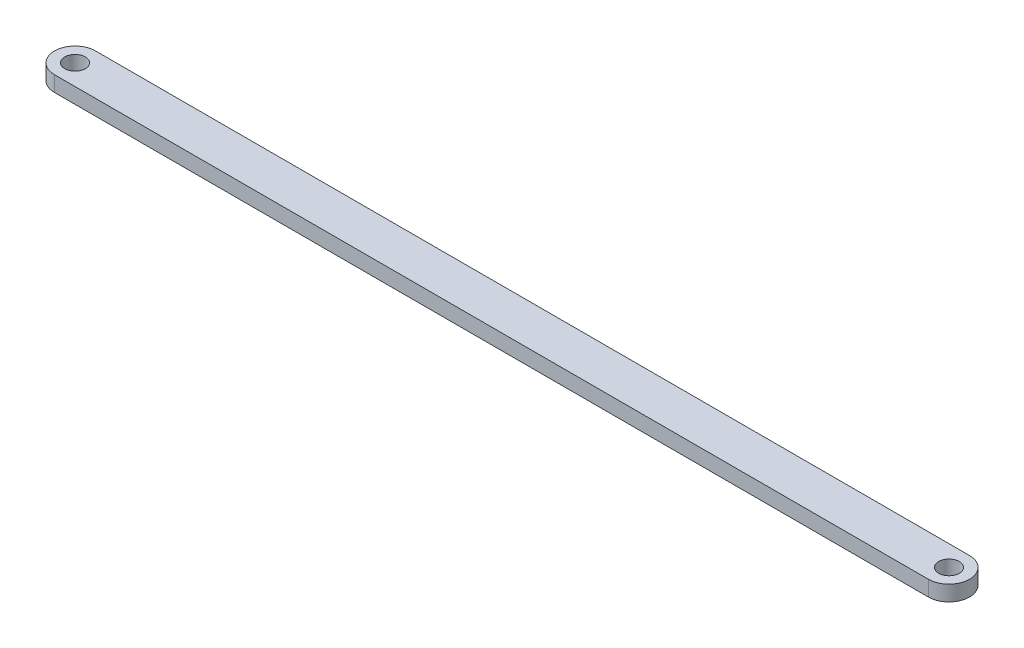
ISO-10303-21;
HEADER;
FILE_DESCRIPTION(('STEP AP214'),'2;1');
FILE_NAME('part.step','',(''),(''),'','','');
FILE_SCHEMA(('AUTOMOTIVE_DESIGN { 1 0 10303 214 1 1 1 1 }'));
ENDSEC;
DATA;
#1=APPLICATION_CONTEXT('core data for automotive mechanical design processes');
#2=APPLICATION_PROTOCOL_DEFINITION('international standard','automotive_design',2000,#1);
#3=PRODUCT_CONTEXT('',#1,'mechanical');
#4=PRODUCT('Part','Part','',(#3));
#5=PRODUCT_RELATED_PRODUCT_CATEGORY('part','',(#4));
#6=PRODUCT_DEFINITION_FORMATION('','',#4);
#7=PRODUCT_DEFINITION_CONTEXT('part definition',#1,'design');
#8=PRODUCT_DEFINITION('design','',#6,#7);
#9=PRODUCT_DEFINITION_SHAPE('','',#8);
#10=(LENGTH_UNIT() NAMED_UNIT(*) SI_UNIT(.MILLI.,.METRE.));
#11=(NAMED_UNIT(*) PLANE_ANGLE_UNIT() SI_UNIT($,.RADIAN.));
#12=(NAMED_UNIT(*) SI_UNIT($,.STERADIAN.) SOLID_ANGLE_UNIT());
#13=UNCERTAINTY_MEASURE_WITH_UNIT(LENGTH_MEASURE(1.E-05),#10,'distance_accuracy_value','');
#14=(GEOMETRIC_REPRESENTATION_CONTEXT(3) GLOBAL_UNCERTAINTY_ASSIGNED_CONTEXT((#13)) GLOBAL_UNIT_ASSIGNED_CONTEXT((#10,
#11,#12)) REPRESENTATION_CONTEXT('',''));
#15=CARTESIAN_POINT('',(0.,0.,0.));
#16=DIRECTION('',(0.,0.,1.));
#17=DIRECTION('',(1.,0.,0.));
#18=AXIS2_PLACEMENT_3D('',#15,#16,#17);
#19=CARTESIAN_POINT('',(0.,3.,0.));
#20=DIRECTION('',(0.,-1.,0.));
#21=DIRECTION('',(0.,0.,-1.));
#22=AXIS2_PLACEMENT_3D('',#19,#20,#21);
#23=CYLINDRICAL_SURFACE('',#22,4.);
#24=CARTESIAN_POINT('',(0.,0.,0.));
#25=DIRECTION('',(0.,1.,0.));
#26=DIRECTION('',(0.,0.,1.));
#27=AXIS2_PLACEMENT_3D('',#24,#25,#26);
#28=CIRCLE('',#27,4.);
#29=CARTESIAN_POINT('',(0.,0.,-4.));
#30=VERTEX_POINT('',#29);
#31=CARTESIAN_POINT('',(0.,0.,4.));
#32=VERTEX_POINT('',#31);
#33=EDGE_CURVE('E106',#30,#32,#28,.T.);
#34=ORIENTED_EDGE('',*,*,#33,.T.);
#35=DIRECTION('',(0.,-1.,0.));
#36=VECTOR('',#35,1.);
#37=CARTESIAN_POINT('',(0.,3.,4.));
#38=LINE('',#37,#36);
#39=CARTESIAN_POINT('',(0.,3.,4.));
#40=VERTEX_POINT('',#39);
#41=EDGE_CURVE('E11',#40,#32,#38,.T.);
#42=ORIENTED_EDGE('',*,*,#41,.F.);
#43=CARTESIAN_POINT('',(0.,3.,0.));
#44=DIRECTION('',(0.,1.,0.));
#45=DIRECTION('',(0.,0.,1.));
#46=AXIS2_PLACEMENT_3D('',#43,#44,#45);
#47=CIRCLE('',#46,4.);
#48=CARTESIAN_POINT('',(0.,3.,-4.));
#49=VERTEX_POINT('',#48);
#50=EDGE_CURVE('E86',#49,#40,#47,.T.);
#51=ORIENTED_EDGE('',*,*,#50,.F.);
#52=DIRECTION('',(0.,-1.,0.));
#53=VECTOR('',#52,1.);
#54=CARTESIAN_POINT('',(0.,3.,-4.));
#55=LINE('',#54,#53);
#56=EDGE_CURVE('E52',#49,#30,#55,.T.);
#57=ORIENTED_EDGE('',*,*,#56,.T.);
#58=EDGE_LOOP('',(#34,#42,#51,#57));
#59=FACE_BOUND('',#58,.T.);
#60=ADVANCED_FACE('F35',(#59),#23,.T.);
#61=CARTESIAN_POINT('',(0.,3.,4.));
#62=DIRECTION('',(0.,0.,-1.));
#63=DIRECTION('',(-1.,0.,0.));
#64=AXIS2_PLACEMENT_3D('',#61,#62,#63);
#65=PLANE('',#64);
#66=DIRECTION('',(1.,0.,0.));
#67=VECTOR('',#66,1.);
#68=CARTESIAN_POINT('',(0.,0.,4.));
#69=LINE('',#68,#67);
#70=CARTESIAN_POINT('',(170.,0.,3.99999999999998));
#71=VERTEX_POINT('',#70);
#72=EDGE_CURVE('E91',#32,#71,#69,.T.);
#73=ORIENTED_EDGE('',*,*,#72,.T.);
#74=DIRECTION('',(0.,-1.,0.));
#75=VECTOR('',#74,1.);
#76=CARTESIAN_POINT('',(170.,3.,3.99999999999998));
#77=LINE('',#76,#75);
#78=CARTESIAN_POINT('',(170.,3.,3.99999999999998));
#79=VERTEX_POINT('',#78);
#80=EDGE_CURVE('E44',#79,#71,#77,.T.);
#81=ORIENTED_EDGE('',*,*,#80,.F.);
#82=DIRECTION('',(1.,0.,0.));
#83=VECTOR('',#82,1.);
#84=CARTESIAN_POINT('',(0.,3.,4.));
#85=LINE('',#84,#83);
#86=EDGE_CURVE('E78',#40,#79,#85,.T.);
#87=ORIENTED_EDGE('',*,*,#86,.F.);
#88=ORIENTED_EDGE('',*,*,#41,.T.);
#89=EDGE_LOOP('',(#73,#81,#87,#88));
#90=FACE_BOUND('',#89,.T.);
#91=ADVANCED_FACE('F90',(#90),#65,.F.);
#92=CARTESIAN_POINT('',(170.,3.,0.));
#93=DIRECTION('',(0.,-1.,0.));
#94=DIRECTION('',(0.,0.,-1.));
#95=AXIS2_PLACEMENT_3D('',#92,#93,#94);
#96=CYLINDRICAL_SURFACE('',#95,3.99999999999999);
#97=CARTESIAN_POINT('',(170.,0.,0.));
#98=DIRECTION('',(0.,1.,0.));
#99=DIRECTION('',(0.,0.,1.));
#100=AXIS2_PLACEMENT_3D('',#97,#98,#99);
#101=CIRCLE('',#100,3.99999999999999);
#102=CARTESIAN_POINT('',(170.,0.,-4.));
#103=VERTEX_POINT('',#102);
#104=EDGE_CURVE('E109',#71,#103,#101,.T.);
#105=ORIENTED_EDGE('',*,*,#104,.T.);
#106=DIRECTION('',(0.,-1.,0.));
#107=VECTOR('',#106,1.);
#108=CARTESIAN_POINT('',(170.,3.,-4.));
#109=LINE('',#108,#107);
#110=CARTESIAN_POINT('',(170.,3.,-4.));
#111=VERTEX_POINT('',#110);
#112=EDGE_CURVE('E67',#111,#103,#109,.T.);
#113=ORIENTED_EDGE('',*,*,#112,.F.);
#114=CARTESIAN_POINT('',(170.,3.,0.));
#115=DIRECTION('',(0.,1.,0.));
#116=DIRECTION('',(0.,0.,1.));
#117=AXIS2_PLACEMENT_3D('',#114,#115,#116);
#118=CIRCLE('',#117,3.99999999999999);
#119=EDGE_CURVE('E85',#79,#111,#118,.T.);
#120=ORIENTED_EDGE('',*,*,#119,.F.);
#121=ORIENTED_EDGE('',*,*,#80,.T.);
#122=EDGE_LOOP('',(#105,#113,#120,#121));
#123=FACE_BOUND('',#122,.T.);
#124=ADVANCED_FACE('F94',(#123),#96,.T.);
#125=CARTESIAN_POINT('',(0.,3.,-4.));
#126=DIRECTION('',(0.,0.,-1.));
#127=DIRECTION('',(-1.,0.,0.));
#128=AXIS2_PLACEMENT_3D('',#125,#126,#127);
#129=PLANE('',#128);
#130=DIRECTION('',(1.,0.,0.));
#131=VECTOR('',#130,1.);
#132=CARTESIAN_POINT('',(0.,0.,-4.));
#133=LINE('',#132,#131);
#134=EDGE_CURVE('E111',#30,#103,#133,.T.);
#135=ORIENTED_EDGE('',*,*,#134,.F.);
#136=ORIENTED_EDGE('',*,*,#56,.F.);
#137=DIRECTION('',(1.,0.,0.));
#138=VECTOR('',#137,1.);
#139=CARTESIAN_POINT('',(0.,3.,-4.));
#140=LINE('',#139,#138);
#141=EDGE_CURVE('E95',#49,#111,#140,.T.);
#142=ORIENTED_EDGE('',*,*,#141,.T.);
#143=ORIENTED_EDGE('',*,*,#112,.T.);
#144=EDGE_LOOP('',(#135,#136,#142,#143));
#145=FACE_BOUND('',#144,.T.);
#146=ADVANCED_FACE('F147',(#145),#129,.T.);
#147=CARTESIAN_POINT('',(0.,3.,0.));
#148=DIRECTION('',(0.,-1.,0.));
#149=DIRECTION('',(0.,0.,-1.));
#150=AXIS2_PLACEMENT_3D('',#147,#148,#149);
#151=CYLINDRICAL_SURFACE('',#150,2.);
#152=CARTESIAN_POINT('',(0.,3.,0.));
#153=DIRECTION('',(0.,1.,0.));
#154=DIRECTION('',(0.,0.,1.));
#155=AXIS2_PLACEMENT_3D('',#152,#153,#154);
#156=CIRCLE('',#155,2.);
#157=CARTESIAN_POINT('',(0.,3.,2.));
#158=VERTEX_POINT('',#157);
#159=EDGE_CURVE('E117',#158,#158,#156,.T.);
#160=ORIENTED_EDGE('',*,*,#159,.T.);
#161=EDGE_LOOP('',(#160));
#162=FACE_BOUND('',#161,.T.);
#163=CARTESIAN_POINT('',(0.,0.,0.));
#164=DIRECTION('',(0.,1.,0.));
#165=DIRECTION('',(0.,0.,1.));
#166=AXIS2_PLACEMENT_3D('',#163,#164,#165);
#167=CIRCLE('',#166,2.);
#168=CARTESIAN_POINT('',(0.,0.,2.));
#169=VERTEX_POINT('',#168);
#170=EDGE_CURVE('E103',#169,#169,#167,.T.);
#171=ORIENTED_EDGE('',*,*,#170,.F.);
#172=EDGE_LOOP('',(#171));
#173=FACE_BOUND('',#172,.T.);
#174=ADVANCED_FACE('F37',(#162,#173),#151,.F.);
#175=CARTESIAN_POINT('',(170.,3.,0.));
#176=DIRECTION('',(0.,-1.,0.));
#177=DIRECTION('',(0.,0.,-1.));
#178=AXIS2_PLACEMENT_3D('',#175,#176,#177);
#179=CYLINDRICAL_SURFACE('',#178,2.);
#180=CARTESIAN_POINT('',(170.,3.,0.));
#181=DIRECTION('',(0.,1.,0.));
#182=DIRECTION('',(0.,0.,1.));
#183=AXIS2_PLACEMENT_3D('',#180,#181,#182);
#184=CIRCLE('',#183,2.);
#185=CARTESIAN_POINT('',(170.,3.,1.99999999999998));
#186=VERTEX_POINT('',#185);
#187=EDGE_CURVE('E97',#186,#186,#184,.T.);
#188=ORIENTED_EDGE('',*,*,#187,.T.);
#189=EDGE_LOOP('',(#188));
#190=FACE_BOUND('',#189,.T.);
#191=CARTESIAN_POINT('',(170.,0.,0.));
#192=DIRECTION('',(0.,1.,0.));
#193=DIRECTION('',(0.,0.,1.));
#194=AXIS2_PLACEMENT_3D('',#191,#192,#193);
#195=CIRCLE('',#194,2.);
#196=CARTESIAN_POINT('',(170.,0.,1.99999999999998));
#197=VERTEX_POINT('',#196);
#198=EDGE_CURVE('E114',#197,#197,#195,.T.);
#199=ORIENTED_EDGE('',*,*,#198,.F.);
#200=EDGE_LOOP('',(#199));
#201=FACE_BOUND('',#200,.T.);
#202=ADVANCED_FACE('F129',(#190,#201),#179,.F.);
#203=CARTESIAN_POINT('',(0.,3.,0.));
#204=DIRECTION('',(0.,1.,0.));
#205=DIRECTION('',(0.,0.,1.));
#206=AXIS2_PLACEMENT_3D('',#203,#204,#205);
#207=PLANE('',#206);
#208=ORIENTED_EDGE('',*,*,#159,.F.);
#209=EDGE_LOOP('',(#208));
#210=FACE_BOUND('',#209,.T.);
#211=ORIENTED_EDGE('',*,*,#50,.T.);
#212=ORIENTED_EDGE('',*,*,#86,.T.);
#213=ORIENTED_EDGE('',*,*,#119,.T.);
#214=ORIENTED_EDGE('',*,*,#141,.F.);
#215=EDGE_LOOP('',(#211,#212,#213,#214));
#216=FACE_BOUND('',#215,.T.);
#217=ORIENTED_EDGE('',*,*,#187,.F.);
#218=EDGE_LOOP('',(#217));
#219=FACE_BOUND('',#218,.T.);
#220=ADVANCED_FACE('F81',(#210,#216,#219),#207,.T.);
#221=CARTESIAN_POINT('',(0.,0.,0.));
#222=DIRECTION('',(0.,1.,0.));
#223=DIRECTION('',(0.,0.,1.));
#224=AXIS2_PLACEMENT_3D('',#221,#222,#223);
#225=PLANE('',#224);
#226=ORIENTED_EDGE('',*,*,#170,.T.);
#227=EDGE_LOOP('',(#226));
#228=FACE_BOUND('',#227,.T.);
#229=ORIENTED_EDGE('',*,*,#33,.F.);
#230=ORIENTED_EDGE('',*,*,#134,.T.);
#231=ORIENTED_EDGE('',*,*,#104,.F.);
#232=ORIENTED_EDGE('',*,*,#72,.F.);
#233=EDGE_LOOP('',(#229,#230,#231,#232));
#234=FACE_BOUND('',#233,.T.);
#235=ORIENTED_EDGE('',*,*,#198,.T.);
#236=EDGE_LOOP('',(#235));
#237=FACE_BOUND('',#236,.T.);
#238=ADVANCED_FACE('F128',(#228,#234,#237),#225,.F.);
#239=CLOSED_SHELL('',(#60,#91,#124,#146,#174,#202,#220,#238));
#240=MANIFOLD_SOLID_BREP('B2',#239);
#241=ADVANCED_BREP_SHAPE_REPRESENTATION('',(#18,#240),#14);
#242=SHAPE_DEFINITION_REPRESENTATION(#9,#241);
ENDSEC;
END-ISO-10303-21;
